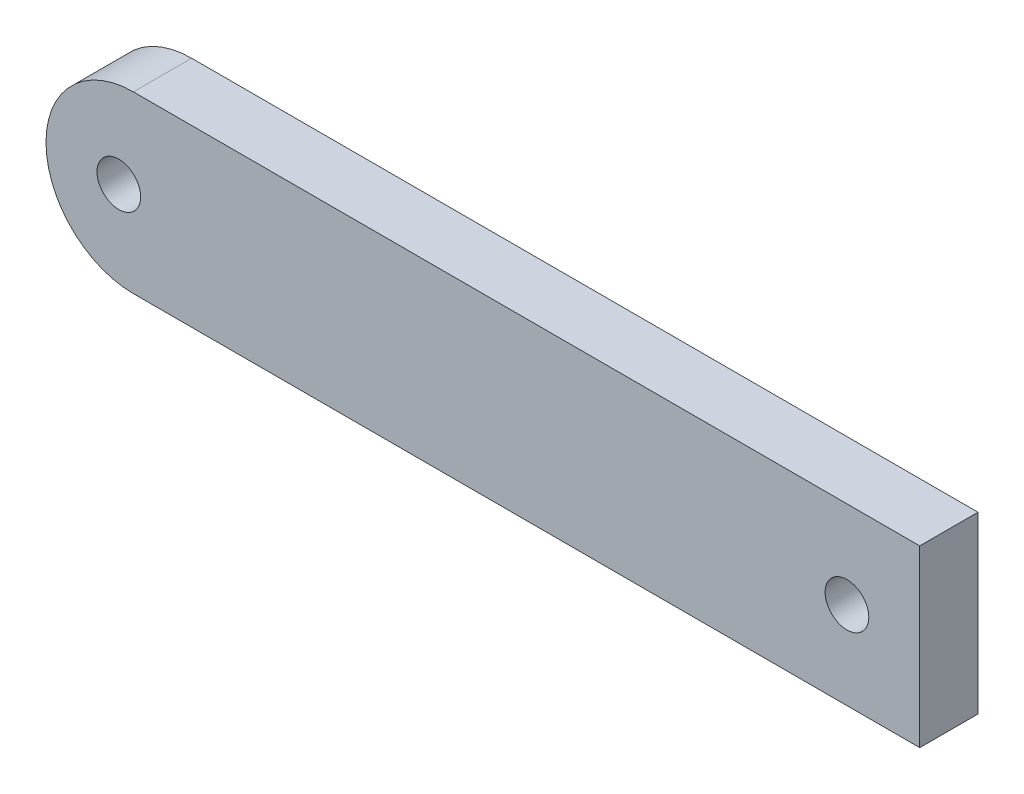
ISO-10303-21;
HEADER;
FILE_DESCRIPTION(('STEP AP214'),'2;1');
FILE_NAME('part.step','',(''),(''),'','','');
FILE_SCHEMA(('AUTOMOTIVE_DESIGN { 1 0 10303 214 1 1 1 1 }'));
ENDSEC;
DATA;
#1=APPLICATION_CONTEXT('core data for automotive mechanical design processes');
#2=APPLICATION_PROTOCOL_DEFINITION('international standard','automotive_design',2000,#1);
#3=PRODUCT_CONTEXT('',#1,'mechanical');
#4=PRODUCT('Part','Part','',(#3));
#5=PRODUCT_RELATED_PRODUCT_CATEGORY('part','',(#4));
#6=PRODUCT_DEFINITION_FORMATION('','',#4);
#7=PRODUCT_DEFINITION_CONTEXT('part definition',#1,'design');
#8=PRODUCT_DEFINITION('design','',#6,#7);
#9=PRODUCT_DEFINITION_SHAPE('','',#8);
#10=(LENGTH_UNIT() NAMED_UNIT(*) SI_UNIT(.MILLI.,.METRE.));
#11=(NAMED_UNIT(*) PLANE_ANGLE_UNIT() SI_UNIT($,.RADIAN.));
#12=(NAMED_UNIT(*) SI_UNIT($,.STERADIAN.) SOLID_ANGLE_UNIT());
#13=UNCERTAINTY_MEASURE_WITH_UNIT(LENGTH_MEASURE(1.E-05),#10,'distance_accuracy_value','');
#14=(GEOMETRIC_REPRESENTATION_CONTEXT(3) GLOBAL_UNCERTAINTY_ASSIGNED_CONTEXT((#13)) GLOBAL_UNIT_ASSIGNED_CONTEXT((#10,
#11,#12)) REPRESENTATION_CONTEXT('',''));
#15=CARTESIAN_POINT('',(0.,0.,0.));
#16=DIRECTION('',(0.,0.,1.));
#17=DIRECTION('',(1.,0.,0.));
#18=AXIS2_PLACEMENT_3D('',#15,#16,#17);
#19=CARTESIAN_POINT('',(0.,0.,4.));
#20=DIRECTION('',(0.,0.,1.));
#21=DIRECTION('',(1.,0.,0.));
#22=AXIS2_PLACEMENT_3D('',#19,#20,#21);
#23=PLANE('',#22);
#24=CARTESIAN_POINT('',(-20.,0.,4.));
#25=DIRECTION('',(0.,0.,1.));
#26=DIRECTION('',(1.,0.,0.));
#27=AXIS2_PLACEMENT_3D('',#24,#25,#26);
#28=CIRCLE('',#27,1.5);
#29=CARTESIAN_POINT('',(-18.5,0.,4.));
#30=VERTEX_POINT('',#29);
#31=EDGE_CURVE('E128',#30,#30,#28,.T.);
#32=ORIENTED_EDGE('',*,*,#31,.F.);
#33=EDGE_LOOP('',(#32));
#34=FACE_BOUND('',#33,.T.);
#35=CARTESIAN_POINT('',(-19.,0.,4.));
#36=DIRECTION('',(0.,0.,1.));
#37=DIRECTION('',(1.,0.,0.));
#38=AXIS2_PLACEMENT_3D('',#35,#36,#37);
#39=CIRCLE('',#38,6.);
#40=CARTESIAN_POINT('',(-19.,6.,4.));
#41=VERTEX_POINT('',#40);
#42=CARTESIAN_POINT('',(-25.,0.,4.));
#43=VERTEX_POINT('',#42);
#44=EDGE_CURVE('E67',#41,#43,#39,.T.);
#45=ORIENTED_EDGE('',*,*,#44,.T.);
#46=CARTESIAN_POINT('',(-19.,0.,4.));
#47=DIRECTION('',(0.,0.,1.));
#48=DIRECTION('',(1.,0.,0.));
#49=AXIS2_PLACEMENT_3D('',#46,#47,#48);
#50=CIRCLE('',#49,6.);
#51=CARTESIAN_POINT('',(-19.,-6.,4.));
#52=VERTEX_POINT('',#51);
#53=EDGE_CURVE('E55',#43,#52,#50,.T.);
#54=ORIENTED_EDGE('',*,*,#53,.T.);
#55=DIRECTION('',(1.,0.,0.));
#56=VECTOR('',#55,1.);
#57=CARTESIAN_POINT('',(35.,-6.,4.));
#58=LINE('',#57,#56);
#59=CARTESIAN_POINT('',(35.,-6.,4.));
#60=VERTEX_POINT('',#59);
#61=EDGE_CURVE('E92',#52,#60,#58,.T.);
#62=ORIENTED_EDGE('',*,*,#61,.T.);
#63=DIRECTION('',(0.,1.,0.));
#64=VECTOR('',#63,1.);
#65=CARTESIAN_POINT('',(35.,-6.,4.));
#66=LINE('',#65,#64);
#67=CARTESIAN_POINT('',(35.,6.,4.));
#68=VERTEX_POINT('',#67);
#69=EDGE_CURVE('E96',#60,#68,#66,.T.);
#70=ORIENTED_EDGE('',*,*,#69,.T.);
#71=DIRECTION('',(-1.,0.,0.));
#72=VECTOR('',#71,1.);
#73=CARTESIAN_POINT('',(35.,6.,4.));
#74=LINE('',#73,#72);
#75=EDGE_CURVE('E119',#68,#41,#74,.T.);
#76=ORIENTED_EDGE('',*,*,#75,.T.);
#77=EDGE_LOOP('',(#45,#54,#62,#70,#76));
#78=FACE_BOUND('',#77,.T.);
#79=CARTESIAN_POINT('',(30.,0.,4.));
#80=DIRECTION('',(0.,0.,1.));
#81=DIRECTION('',(1.,0.,0.));
#82=AXIS2_PLACEMENT_3D('',#79,#80,#81);
#83=CIRCLE('',#82,1.5);
#84=CARTESIAN_POINT('',(31.5,0.,4.));
#85=VERTEX_POINT('',#84);
#86=EDGE_CURVE('E159',#85,#85,#83,.T.);
#87=ORIENTED_EDGE('',*,*,#86,.F.);
#88=EDGE_LOOP('',(#87));
#89=FACE_BOUND('',#88,.T.);
#90=ADVANCED_FACE('F45',(#34,#78,#89),#23,.T.);
#91=CARTESIAN_POINT('',(0.,0.,0.));
#92=DIRECTION('',(0.,0.,1.));
#93=DIRECTION('',(1.,0.,0.));
#94=AXIS2_PLACEMENT_3D('',#91,#92,#93);
#95=PLANE('',#94);
#96=DIRECTION('',(1.,0.,0.));
#97=VECTOR('',#96,1.);
#98=CARTESIAN_POINT('',(35.,-6.,0.));
#99=LINE('',#98,#97);
#100=CARTESIAN_POINT('',(-19.,-6.,0.));
#101=VERTEX_POINT('',#100);
#102=CARTESIAN_POINT('',(35.,-6.,0.));
#103=VERTEX_POINT('',#102);
#104=EDGE_CURVE('E109',#101,#103,#99,.T.);
#105=ORIENTED_EDGE('',*,*,#104,.F.);
#106=CARTESIAN_POINT('',(-19.,0.,0.));
#107=DIRECTION('',(0.,0.,1.));
#108=DIRECTION('',(1.,0.,0.));
#109=AXIS2_PLACEMENT_3D('',#106,#107,#108);
#110=CIRCLE('',#109,6.);
#111=CARTESIAN_POINT('',(-25.,0.,0.));
#112=VERTEX_POINT('',#111);
#113=EDGE_CURVE('E140',#101,#112,#110,.F.);
#114=ORIENTED_EDGE('',*,*,#113,.T.);
#115=CARTESIAN_POINT('',(-19.,0.,0.));
#116=DIRECTION('',(0.,0.,1.));
#117=DIRECTION('',(1.,0.,0.));
#118=AXIS2_PLACEMENT_3D('',#115,#116,#117);
#119=CIRCLE('',#118,6.);
#120=CARTESIAN_POINT('',(-19.,6.,0.));
#121=VERTEX_POINT('',#120);
#122=EDGE_CURVE('E137',#112,#121,#119,.F.);
#123=ORIENTED_EDGE('',*,*,#122,.T.);
#124=DIRECTION('',(-1.,0.,0.));
#125=VECTOR('',#124,1.);
#126=CARTESIAN_POINT('',(35.,6.,0.));
#127=LINE('',#126,#125);
#128=CARTESIAN_POINT('',(35.,6.,0.));
#129=VERTEX_POINT('',#128);
#130=EDGE_CURVE('E103',#129,#121,#127,.T.);
#131=ORIENTED_EDGE('',*,*,#130,.F.);
#132=DIRECTION('',(0.,1.,0.));
#133=VECTOR('',#132,1.);
#134=CARTESIAN_POINT('',(35.,-6.,0.));
#135=LINE('',#134,#133);
#136=EDGE_CURVE('E127',#103,#129,#135,.T.);
#137=ORIENTED_EDGE('',*,*,#136,.F.);
#138=EDGE_LOOP('',(#105,#114,#123,#131,#137));
#139=FACE_BOUND('',#138,.T.);
#140=CARTESIAN_POINT('',(-20.,0.,0.));
#141=DIRECTION('',(0.,0.,1.));
#142=DIRECTION('',(1.,0.,0.));
#143=AXIS2_PLACEMENT_3D('',#140,#141,#142);
#144=CIRCLE('',#143,1.5);
#145=CARTESIAN_POINT('',(-18.5,0.,0.));
#146=VERTEX_POINT('',#145);
#147=EDGE_CURVE('E165',#146,#146,#144,.T.);
#148=ORIENTED_EDGE('',*,*,#147,.T.);
#149=EDGE_LOOP('',(#148));
#150=FACE_BOUND('',#149,.T.);
#151=CARTESIAN_POINT('',(30.,0.,0.));
#152=DIRECTION('',(0.,0.,1.));
#153=DIRECTION('',(1.,0.,0.));
#154=AXIS2_PLACEMENT_3D('',#151,#152,#153);
#155=CIRCLE('',#154,1.5);
#156=CARTESIAN_POINT('',(31.5,0.,0.));
#157=VERTEX_POINT('',#156);
#158=EDGE_CURVE('E156',#157,#157,#155,.T.);
#159=ORIENTED_EDGE('',*,*,#158,.T.);
#160=EDGE_LOOP('',(#159));
#161=FACE_BOUND('',#160,.T.);
#162=ADVANCED_FACE('F148',(#139,#150,#161),#95,.F.);
#163=CARTESIAN_POINT('',(35.,-6.,4.));
#164=DIRECTION('',(0.,1.,0.));
#165=DIRECTION('',(0.,0.,1.));
#166=AXIS2_PLACEMENT_3D('',#163,#164,#165);
#167=PLANE('',#166);
#168=ORIENTED_EDGE('',*,*,#61,.F.);
#169=DIRECTION('',(0.,0.,-1.));
#170=VECTOR('',#169,1.);
#171=CARTESIAN_POINT('',(-19.,-6.,4.));
#172=LINE('',#171,#170);
#173=EDGE_CURVE('E113',#52,#101,#172,.T.);
#174=ORIENTED_EDGE('',*,*,#173,.T.);
#175=ORIENTED_EDGE('',*,*,#104,.T.);
#176=DIRECTION('',(0.,0.,-1.));
#177=VECTOR('',#176,1.);
#178=CARTESIAN_POINT('',(35.,-6.,4.));
#179=LINE('',#178,#177);
#180=EDGE_CURVE('E106',#60,#103,#179,.T.);
#181=ORIENTED_EDGE('',*,*,#180,.F.);
#182=EDGE_LOOP('',(#168,#174,#175,#181));
#183=FACE_BOUND('',#182,.T.);
#184=ADVANCED_FACE('F107',(#183),#167,.F.);
#185=CARTESIAN_POINT('',(35.,-6.,4.));
#186=DIRECTION('',(-1.,0.,0.));
#187=DIRECTION('',(0.,0.,1.));
#188=AXIS2_PLACEMENT_3D('',#185,#186,#187);
#189=PLANE('',#188);
#190=ORIENTED_EDGE('',*,*,#136,.T.);
#191=DIRECTION('',(0.,0.,-1.));
#192=VECTOR('',#191,1.);
#193=CARTESIAN_POINT('',(35.,6.,4.));
#194=LINE('',#193,#192);
#195=EDGE_CURVE('E114',#68,#129,#194,.T.);
#196=ORIENTED_EDGE('',*,*,#195,.F.);
#197=ORIENTED_EDGE('',*,*,#69,.F.);
#198=ORIENTED_EDGE('',*,*,#180,.T.);
#199=EDGE_LOOP('',(#190,#196,#197,#198));
#200=FACE_BOUND('',#199,.T.);
#201=ADVANCED_FACE('F116',(#200),#189,.F.);
#202=CARTESIAN_POINT('',(35.,6.,4.));
#203=DIRECTION('',(0.,-1.,0.));
#204=DIRECTION('',(0.,0.,-1.));
#205=AXIS2_PLACEMENT_3D('',#202,#203,#204);
#206=PLANE('',#205);
#207=ORIENTED_EDGE('',*,*,#130,.T.);
#208=DIRECTION('',(0.,0.,-1.));
#209=VECTOR('',#208,1.);
#210=CARTESIAN_POINT('',(-19.,6.,4.));
#211=LINE('',#210,#209);
#212=EDGE_CURVE('E11',#121,#41,#211,.F.);
#213=ORIENTED_EDGE('',*,*,#212,.T.);
#214=ORIENTED_EDGE('',*,*,#75,.F.);
#215=ORIENTED_EDGE('',*,*,#195,.T.);
#216=EDGE_LOOP('',(#207,#213,#214,#215));
#217=FACE_BOUND('',#216,.T.);
#218=ADVANCED_FACE('F177',(#217),#206,.F.);
#219=CARTESIAN_POINT('',(-20.,0.,4.));
#220=DIRECTION('',(0.,0.,-1.));
#221=DIRECTION('',(-1.,0.,0.));
#222=AXIS2_PLACEMENT_3D('',#219,#220,#221);
#223=CYLINDRICAL_SURFACE('',#222,1.5);
#224=ORIENTED_EDGE('',*,*,#31,.T.);
#225=EDGE_LOOP('',(#224));
#226=FACE_BOUND('',#225,.T.);
#227=ORIENTED_EDGE('',*,*,#147,.F.);
#228=EDGE_LOOP('',(#227));
#229=FACE_BOUND('',#228,.T.);
#230=ADVANCED_FACE('F174',(#226,#229),#223,.F.);
#231=CARTESIAN_POINT('',(30.,0.,4.));
#232=DIRECTION('',(0.,0.,-1.));
#233=DIRECTION('',(-1.,0.,0.));
#234=AXIS2_PLACEMENT_3D('',#231,#232,#233);
#235=CYLINDRICAL_SURFACE('',#234,1.5);
#236=ORIENTED_EDGE('',*,*,#86,.T.);
#237=EDGE_LOOP('',(#236));
#238=FACE_BOUND('',#237,.T.);
#239=ORIENTED_EDGE('',*,*,#158,.F.);
#240=EDGE_LOOP('',(#239));
#241=FACE_BOUND('',#240,.T.);
#242=ADVANCED_FACE('F176',(#238,#241),#235,.F.);
#243=CARTESIAN_POINT('',(-19.,0.,4.));
#244=DIRECTION('',(0.,0.,-1.));
#245=DIRECTION('',(-1.,0.,0.));
#246=AXIS2_PLACEMENT_3D('',#243,#244,#245);
#247=CYLINDRICAL_SURFACE('',#246,6.);
#248=DIRECTION('',(0.,0.,-1.));
#249=VECTOR('',#248,1.);
#250=CARTESIAN_POINT('',(-25.,0.,4.));
#251=LINE('',#250,#249);
#252=EDGE_CURVE('E49',#43,#112,#251,.T.);
#253=ORIENTED_EDGE('',*,*,#252,.F.);
#254=ORIENTED_EDGE('',*,*,#44,.F.);
#255=ORIENTED_EDGE('',*,*,#212,.F.);
#256=ORIENTED_EDGE('',*,*,#122,.F.);
#257=EDGE_LOOP('',(#253,#254,#255,#256));
#258=FACE_BOUND('',#257,.T.);
#259=ADVANCED_FACE('F47',(#258),#247,.T.);
#260=CARTESIAN_POINT('',(-19.,0.,4.));
#261=DIRECTION('',(0.,0.,-1.));
#262=DIRECTION('',(-1.,0.,0.));
#263=AXIS2_PLACEMENT_3D('',#260,#261,#262);
#264=CYLINDRICAL_SURFACE('',#263,6.);
#265=ORIENTED_EDGE('',*,*,#53,.F.);
#266=ORIENTED_EDGE('',*,*,#252,.T.);
#267=ORIENTED_EDGE('',*,*,#113,.F.);
#268=ORIENTED_EDGE('',*,*,#173,.F.);
#269=EDGE_LOOP('',(#265,#266,#267,#268));
#270=FACE_BOUND('',#269,.T.);
#271=ADVANCED_FACE('F154',(#270),#264,.T.);
#272=CLOSED_SHELL('',(#90,#162,#184,#201,#218,#230,#242,#259,#271));
#273=MANIFOLD_SOLID_BREP('B2',#272);
#274=ADVANCED_BREP_SHAPE_REPRESENTATION('',(#18,#273),#14);
#275=SHAPE_DEFINITION_REPRESENTATION(#9,#274);
ENDSEC;
END-ISO-10303-21;
